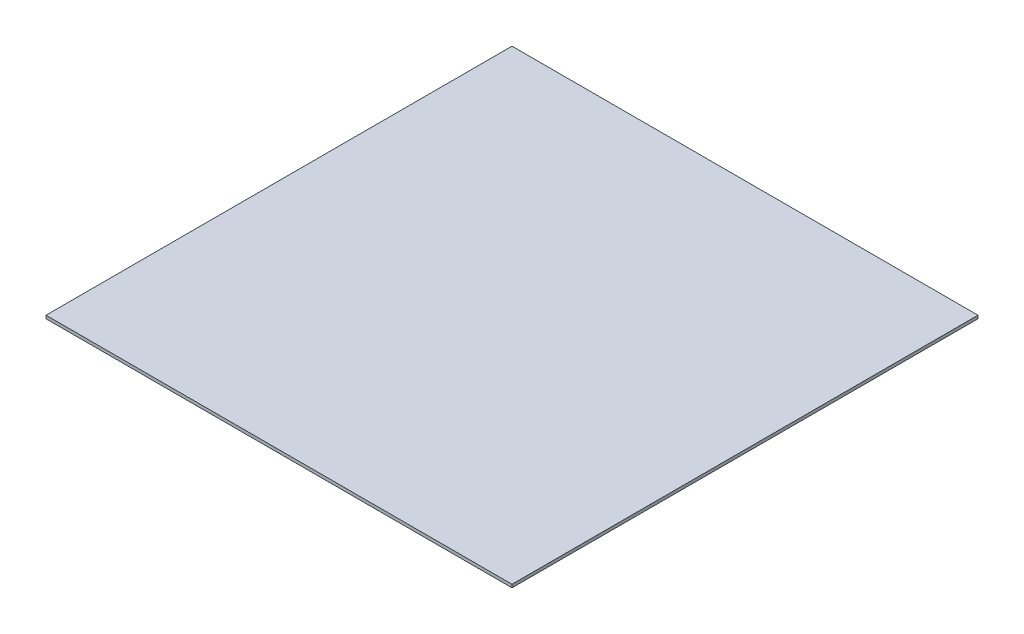
ISO-10303-21;
HEADER;
FILE_DESCRIPTION(('STEP AP214'),'2;1');
FILE_NAME('part.step','',(''),(''),'','','');
FILE_SCHEMA(('AUTOMOTIVE_DESIGN { 1 0 10303 214 1 1 1 1 }'));
ENDSEC;
DATA;
#1=APPLICATION_CONTEXT('core data for automotive mechanical design processes');
#2=APPLICATION_PROTOCOL_DEFINITION('international standard','automotive_design',2000,#1);
#3=PRODUCT_CONTEXT('',#1,'mechanical');
#4=PRODUCT('Part','Part','',(#3));
#5=PRODUCT_RELATED_PRODUCT_CATEGORY('part','',(#4));
#6=PRODUCT_DEFINITION_FORMATION('','',#4);
#7=PRODUCT_DEFINITION_CONTEXT('part definition',#1,'design');
#8=PRODUCT_DEFINITION('design','',#6,#7);
#9=PRODUCT_DEFINITION_SHAPE('','',#8);
#10=(LENGTH_UNIT() NAMED_UNIT(*) SI_UNIT(.MILLI.,.METRE.));
#11=(NAMED_UNIT(*) PLANE_ANGLE_UNIT() SI_UNIT($,.RADIAN.));
#12=(NAMED_UNIT(*) SI_UNIT($,.STERADIAN.) SOLID_ANGLE_UNIT());
#13=UNCERTAINTY_MEASURE_WITH_UNIT(LENGTH_MEASURE(1.E-05),#10,'distance_accuracy_value','');
#14=(GEOMETRIC_REPRESENTATION_CONTEXT(3) GLOBAL_UNCERTAINTY_ASSIGNED_CONTEXT((#13)) GLOBAL_UNIT_ASSIGNED_CONTEXT((#10,
#11,#12)) REPRESENTATION_CONTEXT('',''));
#15=CARTESIAN_POINT('',(0.,0.,0.));
#16=DIRECTION('',(0.,0.,1.));
#17=DIRECTION('',(1.,0.,0.));
#18=AXIS2_PLACEMENT_3D('',#15,#16,#17);
#19=CARTESIAN_POINT('',(7.5,0.1,7.5));
#20=DIRECTION('',(-1.,0.,0.));
#21=DIRECTION('',(0.,0.,1.));
#22=AXIS2_PLACEMENT_3D('',#19,#20,#21);
#23=PLANE('',#22);
#24=DIRECTION('',(0.,0.,-1.));
#25=VECTOR('',#24,1.);
#26=CARTESIAN_POINT('',(7.5,0.,7.5));
#27=LINE('',#26,#25);
#28=CARTESIAN_POINT('',(7.5,0.,7.5));
#29=VERTEX_POINT('',#28);
#30=CARTESIAN_POINT('',(7.5,0.,-7.5));
#31=VERTEX_POINT('',#30);
#32=EDGE_CURVE('E97',#29,#31,#27,.T.);
#33=ORIENTED_EDGE('',*,*,#32,.T.);
#34=DIRECTION('',(0.,-1.,0.));
#35=VECTOR('',#34,1.);
#36=CARTESIAN_POINT('',(7.5,0.1,-7.5));
#37=LINE('',#36,#35);
#38=CARTESIAN_POINT('',(7.5,0.1,-7.5));
#39=VERTEX_POINT('',#38);
#40=EDGE_CURVE('E11',#39,#31,#37,.T.);
#41=ORIENTED_EDGE('',*,*,#40,.F.);
#42=DIRECTION('',(0.,0.,-1.));
#43=VECTOR('',#42,1.);
#44=CARTESIAN_POINT('',(7.5,0.1,7.5));
#45=LINE('',#44,#43);
#46=CARTESIAN_POINT('',(7.5,0.1,7.5));
#47=VERTEX_POINT('',#46);
#48=EDGE_CURVE('E85',#47,#39,#45,.T.);
#49=ORIENTED_EDGE('',*,*,#48,.F.);
#50=DIRECTION('',(0.,-1.,0.));
#51=VECTOR('',#50,1.);
#52=CARTESIAN_POINT('',(7.5,0.1,7.5));
#53=LINE('',#52,#51);
#54=EDGE_CURVE('E93',#47,#29,#53,.T.);
#55=ORIENTED_EDGE('',*,*,#54,.T.);
#56=EDGE_LOOP('',(#33,#41,#49,#55));
#57=FACE_BOUND('',#56,.T.);
#58=ADVANCED_FACE('F34',(#57),#23,.F.);
#59=CARTESIAN_POINT('',(-7.5,0.1,-7.5));
#60=DIRECTION('',(0.,0.,1.));
#61=DIRECTION('',(1.,0.,0.));
#62=AXIS2_PLACEMENT_3D('',#59,#60,#61);
#63=PLANE('',#62);
#64=DIRECTION('',(-1.,0.,0.));
#65=VECTOR('',#64,1.);
#66=CARTESIAN_POINT('',(-7.5,0.,-7.5));
#67=LINE('',#66,#65);
#68=CARTESIAN_POINT('',(-7.5,0.,-7.5));
#69=VERTEX_POINT('',#68);
#70=EDGE_CURVE('E89',#31,#69,#67,.T.);
#71=ORIENTED_EDGE('',*,*,#70,.T.);
#72=DIRECTION('',(0.,-1.,0.));
#73=VECTOR('',#72,1.);
#74=CARTESIAN_POINT('',(-7.5,0.1,-7.5));
#75=LINE('',#74,#73);
#76=CARTESIAN_POINT('',(-7.5,0.1,-7.5));
#77=VERTEX_POINT('',#76);
#78=EDGE_CURVE('E42',#77,#69,#75,.T.);
#79=ORIENTED_EDGE('',*,*,#78,.F.);
#80=DIRECTION('',(-1.,0.,0.));
#81=VECTOR('',#80,1.);
#82=CARTESIAN_POINT('',(-7.5,0.1,-7.5));
#83=LINE('',#82,#81);
#84=EDGE_CURVE('E80',#39,#77,#83,.T.);
#85=ORIENTED_EDGE('',*,*,#84,.F.);
#86=ORIENTED_EDGE('',*,*,#40,.T.);
#87=EDGE_LOOP('',(#71,#79,#85,#86));
#88=FACE_BOUND('',#87,.T.);
#89=ADVANCED_FACE('F88',(#88),#63,.F.);
#90=CARTESIAN_POINT('',(-7.5,0.1,7.5));
#91=DIRECTION('',(1.,0.,0.));
#92=DIRECTION('',(0.,0.,-1.));
#93=AXIS2_PLACEMENT_3D('',#90,#91,#92);
#94=PLANE('',#93);
#95=DIRECTION('',(0.,0.,1.));
#96=VECTOR('',#95,1.);
#97=CARTESIAN_POINT('',(-7.5,0.,7.5));
#98=LINE('',#97,#96);
#99=CARTESIAN_POINT('',(-7.5,0.,7.5));
#100=VERTEX_POINT('',#99);
#101=EDGE_CURVE('E67',#69,#100,#98,.T.);
#102=ORIENTED_EDGE('',*,*,#101,.T.);
#103=DIRECTION('',(0.,-1.,0.));
#104=VECTOR('',#103,1.);
#105=CARTESIAN_POINT('',(-7.5,0.1,7.5));
#106=LINE('',#105,#104);
#107=CARTESIAN_POINT('',(-7.5,0.1,7.5));
#108=VERTEX_POINT('',#107);
#109=EDGE_CURVE('E90',#108,#100,#106,.T.);
#110=ORIENTED_EDGE('',*,*,#109,.F.);
#111=DIRECTION('',(0.,0.,1.));
#112=VECTOR('',#111,1.);
#113=CARTESIAN_POINT('',(-7.5,0.1,7.5));
#114=LINE('',#113,#112);
#115=EDGE_CURVE('E83',#77,#108,#114,.T.);
#116=ORIENTED_EDGE('',*,*,#115,.F.);
#117=ORIENTED_EDGE('',*,*,#78,.T.);
#118=EDGE_LOOP('',(#102,#110,#116,#117));
#119=FACE_BOUND('',#118,.T.);
#120=ADVANCED_FACE('F91',(#119),#94,.F.);
#121=CARTESIAN_POINT('',(-7.5,0.1,7.5));
#122=DIRECTION('',(0.,0.,-1.));
#123=DIRECTION('',(-1.,0.,0.));
#124=AXIS2_PLACEMENT_3D('',#121,#122,#123);
#125=PLANE('',#124);
#126=DIRECTION('',(1.,0.,0.));
#127=VECTOR('',#126,1.);
#128=CARTESIAN_POINT('',(-7.5,0.,7.5));
#129=LINE('',#128,#127);
#130=EDGE_CURVE('E73',#100,#29,#129,.T.);
#131=ORIENTED_EDGE('',*,*,#130,.T.);
#132=ORIENTED_EDGE('',*,*,#54,.F.);
#133=DIRECTION('',(1.,0.,0.));
#134=VECTOR('',#133,1.);
#135=CARTESIAN_POINT('',(-7.5,0.1,7.5));
#136=LINE('',#135,#134);
#137=EDGE_CURVE('E50',#108,#47,#136,.T.);
#138=ORIENTED_EDGE('',*,*,#137,.F.);
#139=ORIENTED_EDGE('',*,*,#109,.T.);
#140=EDGE_LOOP('',(#131,#132,#138,#139));
#141=FACE_BOUND('',#140,.T.);
#142=ADVANCED_FACE('F104',(#141),#125,.F.);
#143=CARTESIAN_POINT('',(0.,0.1,0.));
#144=DIRECTION('',(0.,-1.,0.));
#145=DIRECTION('',(0.,0.,-1.));
#146=AXIS2_PLACEMENT_3D('',#143,#144,#145);
#147=PLANE('',#146);
#148=ORIENTED_EDGE('',*,*,#48,.T.);
#149=ORIENTED_EDGE('',*,*,#84,.T.);
#150=ORIENTED_EDGE('',*,*,#115,.T.);
#151=ORIENTED_EDGE('',*,*,#137,.T.);
#152=EDGE_LOOP('',(#148,#149,#150,#151));
#153=FACE_BOUND('',#152,.T.);
#154=ADVANCED_FACE('F81',(#153),#147,.F.);
#155=CARTESIAN_POINT('',(0.,0.,0.));
#156=DIRECTION('',(0.,-1.,0.));
#157=DIRECTION('',(0.,0.,-1.));
#158=AXIS2_PLACEMENT_3D('',#155,#156,#157);
#159=PLANE('',#158);
#160=ORIENTED_EDGE('',*,*,#32,.F.);
#161=ORIENTED_EDGE('',*,*,#130,.F.);
#162=ORIENTED_EDGE('',*,*,#101,.F.);
#163=ORIENTED_EDGE('',*,*,#70,.F.);
#164=EDGE_LOOP('',(#160,#161,#162,#163));
#165=FACE_BOUND('',#164,.T.);
#166=ADVANCED_FACE('F107',(#165),#159,.T.);
#167=CLOSED_SHELL('',(#58,#89,#120,#142,#154,#166));
#168=MANIFOLD_SOLID_BREP('B2',#167);
#169=ADVANCED_BREP_SHAPE_REPRESENTATION('',(#18,#168),#14);
#170=SHAPE_DEFINITION_REPRESENTATION(#9,#169);
ENDSEC;
END-ISO-10303-21;
